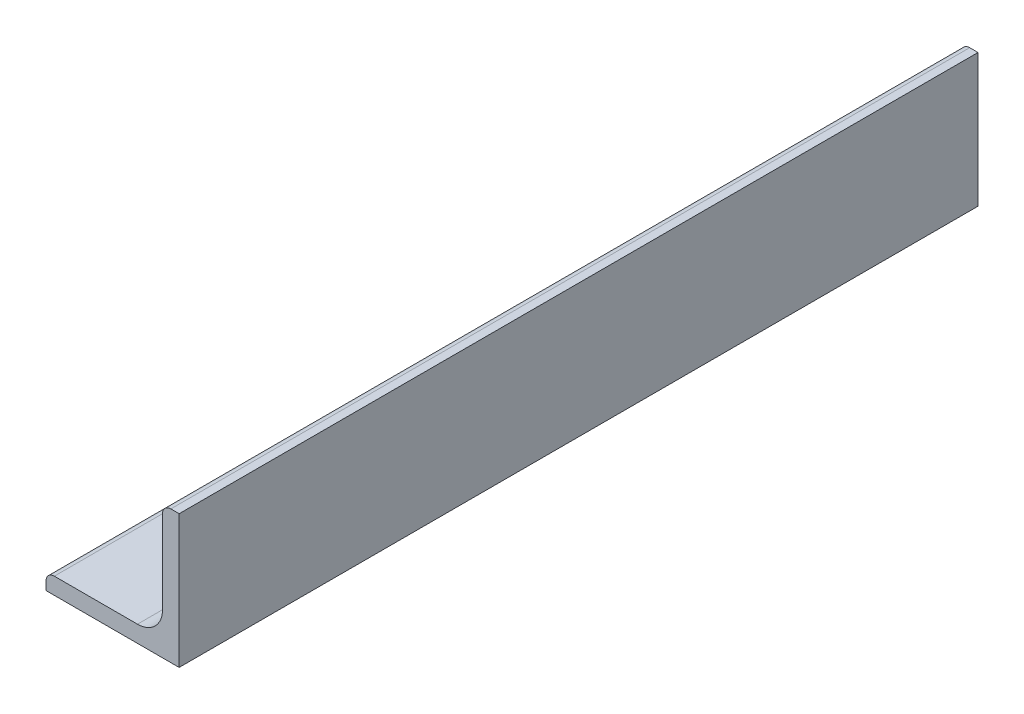
ISO-10303-21;
HEADER;
FILE_DESCRIPTION(('STEP AP214'),'2;1');
FILE_NAME('part.step','',(''),(''),'','','');
FILE_SCHEMA(('AUTOMOTIVE_DESIGN { 1 0 10303 214 1 1 1 1 }'));
ENDSEC;
DATA;
#1=APPLICATION_CONTEXT('core data for automotive mechanical design processes');
#2=APPLICATION_PROTOCOL_DEFINITION('international standard','automotive_design',2000,#1);
#3=PRODUCT_CONTEXT('',#1,'mechanical');
#4=PRODUCT('Part','Part','',(#3));
#5=PRODUCT_RELATED_PRODUCT_CATEGORY('part','',(#4));
#6=PRODUCT_DEFINITION_FORMATION('','',#4);
#7=PRODUCT_DEFINITION_CONTEXT('part definition',#1,'design');
#8=PRODUCT_DEFINITION('design','',#6,#7);
#9=PRODUCT_DEFINITION_SHAPE('','',#8);
#10=(LENGTH_UNIT() NAMED_UNIT(*) SI_UNIT(.MILLI.,.METRE.));
#11=(NAMED_UNIT(*) PLANE_ANGLE_UNIT() SI_UNIT($,.RADIAN.));
#12=(NAMED_UNIT(*) SI_UNIT($,.STERADIAN.) SOLID_ANGLE_UNIT());
#13=UNCERTAINTY_MEASURE_WITH_UNIT(LENGTH_MEASURE(1.E-05),#10,'distance_accuracy_value','');
#14=(GEOMETRIC_REPRESENTATION_CONTEXT(3) GLOBAL_UNCERTAINTY_ASSIGNED_CONTEXT((#13)) GLOBAL_UNIT_ASSIGNED_CONTEXT((#10,
#11,#12)) REPRESENTATION_CONTEXT('',''));
#15=CARTESIAN_POINT('',(0.,0.,0.));
#16=DIRECTION('',(0.,0.,1.));
#17=DIRECTION('',(1.,0.,0.));
#18=AXIS2_PLACEMENT_3D('',#15,#16,#17);
#19=CARTESIAN_POINT('',(-12.7,-11.1125,76.2));
#20=DIRECTION('',(1.,0.,0.));
#21=DIRECTION('',(0.,1.,0.));
#22=AXIS2_PLACEMENT_3D('',#19,#20,#21);
#23=PLANE('',#22);
#24=DIRECTION('',(0.,-1.,0.));
#25=VECTOR('',#24,1.);
#26=CARTESIAN_POINT('',(-12.7,-11.1125,-76.2));
#27=LINE('',#26,#25);
#28=CARTESIAN_POINT('',(-12.7,-11.1125,-76.2));
#29=VERTEX_POINT('',#28);
#30=CARTESIAN_POINT('',(-12.7,-12.7,-76.2));
#31=VERTEX_POINT('',#30);
#32=EDGE_CURVE('E152',#29,#31,#27,.T.);
#33=ORIENTED_EDGE('',*,*,#32,.T.);
#34=DIRECTION('',(0.,0.,-1.));
#35=VECTOR('',#34,1.);
#36=CARTESIAN_POINT('',(-12.7,-12.7,76.2));
#37=LINE('',#36,#35);
#38=CARTESIAN_POINT('',(-12.7,-12.7,76.2));
#39=VERTEX_POINT('',#38);
#40=EDGE_CURVE('E11',#39,#31,#37,.T.);
#41=ORIENTED_EDGE('',*,*,#40,.F.);
#42=DIRECTION('',(0.,-1.,0.));
#43=VECTOR('',#42,1.);
#44=CARTESIAN_POINT('',(-12.7,-11.1125,76.2));
#45=LINE('',#44,#43);
#46=CARTESIAN_POINT('',(-12.7,-11.1125,76.2));
#47=VERTEX_POINT('',#46);
#48=EDGE_CURVE('E177',#47,#39,#45,.T.);
#49=ORIENTED_EDGE('',*,*,#48,.F.);
#50=DIRECTION('',(0.,0.,-1.));
#51=VECTOR('',#50,1.);
#52=CARTESIAN_POINT('',(-12.7,-11.1125,76.2));
#53=LINE('',#52,#51);
#54=EDGE_CURVE('E148',#47,#29,#53,.T.);
#55=ORIENTED_EDGE('',*,*,#54,.T.);
#56=EDGE_LOOP('',(#33,#41,#49,#55));
#57=FACE_BOUND('',#56,.T.);
#58=ADVANCED_FACE('F45',(#57),#23,.F.);
#59=CARTESIAN_POINT('',(-12.7,-12.7,76.2));
#60=DIRECTION('',(0.,1.,0.));
#61=DIRECTION('',(-1.,0.,0.));
#62=AXIS2_PLACEMENT_3D('',#59,#60,#61);
#63=PLANE('',#62);
#64=DIRECTION('',(1.,0.,0.));
#65=VECTOR('',#64,1.);
#66=CARTESIAN_POINT('',(-12.7,-12.7,-76.2));
#67=LINE('',#66,#65);
#68=CARTESIAN_POINT('',(12.7,-12.7,-76.2));
#69=VERTEX_POINT('',#68);
#70=EDGE_CURVE('E156',#31,#69,#67,.T.);
#71=ORIENTED_EDGE('',*,*,#70,.T.);
#72=DIRECTION('',(0.,0.,-1.));
#73=VECTOR('',#72,1.);
#74=CARTESIAN_POINT('',(12.7,-12.7,76.2));
#75=LINE('',#74,#73);
#76=CARTESIAN_POINT('',(12.7,-12.7,76.2));
#77=VERTEX_POINT('',#76);
#78=EDGE_CURVE('E54',#77,#69,#75,.T.);
#79=ORIENTED_EDGE('',*,*,#78,.F.);
#80=DIRECTION('',(1.,0.,0.));
#81=VECTOR('',#80,1.);
#82=CARTESIAN_POINT('',(-12.7,-12.7,76.2));
#83=LINE('',#82,#81);
#84=EDGE_CURVE('E108',#39,#77,#83,.T.);
#85=ORIENTED_EDGE('',*,*,#84,.F.);
#86=ORIENTED_EDGE('',*,*,#40,.T.);
#87=EDGE_LOOP('',(#71,#79,#85,#86));
#88=FACE_BOUND('',#87,.T.);
#89=ADVANCED_FACE('F233',(#88),#63,.F.);
#90=CARTESIAN_POINT('',(12.7,-12.7,76.2));
#91=DIRECTION('',(-1.,0.,0.));
#92=DIRECTION('',(0.,-1.,0.));
#93=AXIS2_PLACEMENT_3D('',#90,#91,#92);
#94=PLANE('',#93);
#95=DIRECTION('',(0.,1.,0.));
#96=VECTOR('',#95,1.);
#97=CARTESIAN_POINT('',(12.7,-12.7,-76.2));
#98=LINE('',#97,#96);
#99=CARTESIAN_POINT('',(12.7,12.7,-76.2));
#100=VERTEX_POINT('',#99);
#101=EDGE_CURVE('E159',#69,#100,#98,.T.);
#102=ORIENTED_EDGE('',*,*,#101,.T.);
#103=DIRECTION('',(0.,0.,-1.));
#104=VECTOR('',#103,1.);
#105=CARTESIAN_POINT('',(12.7,12.7,76.2));
#106=LINE('',#105,#104);
#107=CARTESIAN_POINT('',(12.7,12.7,76.2));
#108=VERTEX_POINT('',#107);
#109=EDGE_CURVE('E192',#108,#100,#106,.T.);
#110=ORIENTED_EDGE('',*,*,#109,.F.);
#111=DIRECTION('',(0.,1.,0.));
#112=VECTOR('',#111,1.);
#113=CARTESIAN_POINT('',(12.7,-12.7,76.2));
#114=LINE('',#113,#112);
#115=EDGE_CURVE('E202',#77,#108,#114,.T.);
#116=ORIENTED_EDGE('',*,*,#115,.F.);
#117=ORIENTED_EDGE('',*,*,#78,.T.);
#118=EDGE_LOOP('',(#102,#110,#116,#117));
#119=FACE_BOUND('',#118,.T.);
#120=ADVANCED_FACE('F200',(#119),#94,.F.);
#121=CARTESIAN_POINT('',(11.1125,12.7,76.2));
#122=DIRECTION('',(0.,-1.,0.));
#123=DIRECTION('',(0.,0.,-1.));
#124=AXIS2_PLACEMENT_3D('',#121,#122,#123);
#125=PLANE('',#124);
#126=DIRECTION('',(-1.,0.,0.));
#127=VECTOR('',#126,1.);
#128=CARTESIAN_POINT('',(11.1125,12.7,-76.2));
#129=LINE('',#128,#127);
#130=CARTESIAN_POINT('',(11.1125,12.7,-76.2));
#131=VERTEX_POINT('',#130);
#132=EDGE_CURVE('E162',#100,#131,#129,.T.);
#133=ORIENTED_EDGE('',*,*,#132,.T.);
#134=DIRECTION('',(0.,0.,-1.));
#135=VECTOR('',#134,1.);
#136=CARTESIAN_POINT('',(11.1125,12.7,76.2));
#137=LINE('',#136,#135);
#138=CARTESIAN_POINT('',(11.1125,12.7,76.2));
#139=VERTEX_POINT('',#138);
#140=EDGE_CURVE('E188',#139,#131,#137,.T.);
#141=ORIENTED_EDGE('',*,*,#140,.F.);
#142=DIRECTION('',(-1.,0.,0.));
#143=VECTOR('',#142,1.);
#144=CARTESIAN_POINT('',(11.1125,12.7,76.2));
#145=LINE('',#144,#143);
#146=EDGE_CURVE('E219',#108,#139,#145,.T.);
#147=ORIENTED_EDGE('',*,*,#146,.F.);
#148=ORIENTED_EDGE('',*,*,#109,.T.);
#149=EDGE_LOOP('',(#133,#141,#147,#148));
#150=FACE_BOUND('',#149,.T.);
#151=ADVANCED_FACE('F211',(#150),#125,.F.);
#152=CARTESIAN_POINT('',(11.1125,11.1125,76.2));
#153=DIRECTION('',(0.,0.,-1.));
#154=DIRECTION('',(-1.,0.,0.));
#155=AXIS2_PLACEMENT_3D('',#152,#153,#154);
#156=CYLINDRICAL_SURFACE('',#155,1.5875);
#157=CARTESIAN_POINT('',(11.1125,11.1125,-76.2));
#158=DIRECTION('',(0.,0.,1.));
#159=DIRECTION('',(-1.,0.,0.));
#160=AXIS2_PLACEMENT_3D('',#157,#158,#159);
#161=CIRCLE('',#160,1.5875);
#162=CARTESIAN_POINT('',(9.525,11.1125,-76.2));
#163=VERTEX_POINT('',#162);
#164=EDGE_CURVE('E165',#131,#163,#161,.T.);
#165=ORIENTED_EDGE('',*,*,#164,.T.);
#166=DIRECTION('',(0.,0.,-1.));
#167=VECTOR('',#166,1.);
#168=CARTESIAN_POINT('',(9.525,11.1125,76.2));
#169=LINE('',#168,#167);
#170=CARTESIAN_POINT('',(9.525,11.1125,76.2));
#171=VERTEX_POINT('',#170);
#172=EDGE_CURVE('E184',#171,#163,#169,.T.);
#173=ORIENTED_EDGE('',*,*,#172,.F.);
#174=CARTESIAN_POINT('',(11.1125,11.1125,76.2));
#175=DIRECTION('',(0.,0.,1.));
#176=DIRECTION('',(-1.,0.,0.));
#177=AXIS2_PLACEMENT_3D('',#174,#175,#176);
#178=CIRCLE('',#177,1.5875);
#179=EDGE_CURVE('E217',#139,#171,#178,.T.);
#180=ORIENTED_EDGE('',*,*,#179,.F.);
#181=ORIENTED_EDGE('',*,*,#140,.T.);
#182=EDGE_LOOP('',(#165,#173,#180,#181));
#183=FACE_BOUND('',#182,.T.);
#184=ADVANCED_FACE('F215',(#183),#156,.T.);
#185=CARTESIAN_POINT('',(9.525,11.1125,76.2));
#186=DIRECTION('',(1.,0.,0.));
#187=DIRECTION('',(0.,0.,-1.));
#188=AXIS2_PLACEMENT_3D('',#185,#186,#187);
#189=PLANE('',#188);
#190=DIRECTION('',(0.,-1.,0.));
#191=VECTOR('',#190,1.);
#192=CARTESIAN_POINT('',(9.525,11.1125,-76.2));
#193=LINE('',#192,#191);
#194=CARTESIAN_POINT('',(9.525,-4.74979999999999,-76.2));
#195=VERTEX_POINT('',#194);
#196=EDGE_CURVE('E168',#163,#195,#193,.T.);
#197=ORIENTED_EDGE('',*,*,#196,.T.);
#198=DIRECTION('',(0.,0.,-1.));
#199=VECTOR('',#198,1.);
#200=CARTESIAN_POINT('',(9.525,-4.74979999999999,76.2));
#201=LINE('',#200,#199);
#202=CARTESIAN_POINT('',(9.525,-4.74979999999999,76.2));
#203=VERTEX_POINT('',#202);
#204=EDGE_CURVE('E141',#203,#195,#201,.T.);
#205=ORIENTED_EDGE('',*,*,#204,.F.);
#206=DIRECTION('',(0.,-1.,0.));
#207=VECTOR('',#206,1.);
#208=CARTESIAN_POINT('',(9.525,11.1125,76.2));
#209=LINE('',#208,#207);
#210=EDGE_CURVE('E130',#171,#203,#209,.T.);
#211=ORIENTED_EDGE('',*,*,#210,.F.);
#212=ORIENTED_EDGE('',*,*,#172,.T.);
#213=EDGE_LOOP('',(#197,#205,#211,#212));
#214=FACE_BOUND('',#213,.T.);
#215=ADVANCED_FACE('F245',(#214),#189,.F.);
#216=CARTESIAN_POINT('',(4.7498,-4.74979999999999,76.2));
#217=DIRECTION('',(0.,0.,-1.));
#218=DIRECTION('',(-1.,0.,0.));
#219=AXIS2_PLACEMENT_3D('',#216,#217,#218);
#220=CYLINDRICAL_SURFACE('',#219,4.7752);
#221=CARTESIAN_POINT('',(4.7498,-4.74979999999999,-76.2));
#222=DIRECTION('',(0.,0.,-1.));
#223=DIRECTION('',(-1.,0.,0.));
#224=AXIS2_PLACEMENT_3D('',#221,#222,#223);
#225=CIRCLE('',#224,4.7752);
#226=CARTESIAN_POINT('',(4.7498,-9.525,-76.2));
#227=VERTEX_POINT('',#226);
#228=EDGE_CURVE('E139',#195,#227,#225,.T.);
#229=ORIENTED_EDGE('',*,*,#228,.T.);
#230=DIRECTION('',(0.,0.,-1.));
#231=VECTOR('',#230,1.);
#232=CARTESIAN_POINT('',(4.7498,-9.525,76.2));
#233=LINE('',#232,#231);
#234=CARTESIAN_POINT('',(4.7498,-9.525,76.2));
#235=VERTEX_POINT('',#234);
#236=EDGE_CURVE('E136',#235,#227,#233,.T.);
#237=ORIENTED_EDGE('',*,*,#236,.F.);
#238=CARTESIAN_POINT('',(4.7498,-4.74979999999999,76.2));
#239=DIRECTION('',(0.,0.,-1.));
#240=DIRECTION('',(-1.,0.,0.));
#241=AXIS2_PLACEMENT_3D('',#238,#239,#240);
#242=CIRCLE('',#241,4.7752);
#243=EDGE_CURVE('E124',#203,#235,#242,.T.);
#244=ORIENTED_EDGE('',*,*,#243,.F.);
#245=ORIENTED_EDGE('',*,*,#204,.T.);
#246=EDGE_LOOP('',(#229,#237,#244,#245));
#247=FACE_BOUND('',#246,.T.);
#248=ADVANCED_FACE('F137',(#247),#220,.F.);
#249=CARTESIAN_POINT('',(4.7498,-9.525,76.2));
#250=DIRECTION('',(0.,-1.,0.));
#251=DIRECTION('',(1.,0.,0.));
#252=AXIS2_PLACEMENT_3D('',#249,#250,#251);
#253=PLANE('',#252);
#254=DIRECTION('',(-1.,0.,0.));
#255=VECTOR('',#254,1.);
#256=CARTESIAN_POINT('',(4.7498,-9.525,-76.2));
#257=LINE('',#256,#255);
#258=CARTESIAN_POINT('',(-11.1125,-9.525,-76.2));
#259=VERTEX_POINT('',#258);
#260=EDGE_CURVE('E94',#227,#259,#257,.T.);
#261=ORIENTED_EDGE('',*,*,#260,.T.);
#262=DIRECTION('',(0.,0.,-1.));
#263=VECTOR('',#262,1.);
#264=CARTESIAN_POINT('',(-11.1125,-9.525,76.2));
#265=LINE('',#264,#263);
#266=CARTESIAN_POINT('',(-11.1125,-9.525,76.2));
#267=VERTEX_POINT('',#266);
#268=EDGE_CURVE('E142',#267,#259,#265,.T.);
#269=ORIENTED_EDGE('',*,*,#268,.F.);
#270=DIRECTION('',(-1.,0.,0.));
#271=VECTOR('',#270,1.);
#272=CARTESIAN_POINT('',(4.7498,-9.525,76.2));
#273=LINE('',#272,#271);
#274=EDGE_CURVE('E128',#235,#267,#273,.T.);
#275=ORIENTED_EDGE('',*,*,#274,.F.);
#276=ORIENTED_EDGE('',*,*,#236,.T.);
#277=EDGE_LOOP('',(#261,#269,#275,#276));
#278=FACE_BOUND('',#277,.T.);
#279=ADVANCED_FACE('F144',(#278),#253,.F.);
#280=CARTESIAN_POINT('',(-11.1125,-11.1125,76.2));
#281=DIRECTION('',(0.,0.,-1.));
#282=DIRECTION('',(-1.,0.,0.));
#283=AXIS2_PLACEMENT_3D('',#280,#281,#282);
#284=CYLINDRICAL_SURFACE('',#283,1.5875);
#285=CARTESIAN_POINT('',(-11.1125,-11.1125,-76.2));
#286=DIRECTION('',(0.,0.,1.));
#287=DIRECTION('',(-1.,0.,0.));
#288=AXIS2_PLACEMENT_3D('',#285,#286,#287);
#289=CIRCLE('',#288,1.5875);
#290=EDGE_CURVE('E100',#259,#29,#289,.T.);
#291=ORIENTED_EDGE('',*,*,#290,.T.);
#292=ORIENTED_EDGE('',*,*,#54,.F.);
#293=CARTESIAN_POINT('',(-11.1125,-11.1125,76.2));
#294=DIRECTION('',(0.,0.,1.));
#295=DIRECTION('',(-1.,0.,0.));
#296=AXIS2_PLACEMENT_3D('',#293,#294,#295);
#297=CIRCLE('',#296,1.5875);
#298=EDGE_CURVE('E62',#267,#47,#297,.T.);
#299=ORIENTED_EDGE('',*,*,#298,.F.);
#300=ORIENTED_EDGE('',*,*,#268,.T.);
#301=EDGE_LOOP('',(#291,#292,#299,#300));
#302=FACE_BOUND('',#301,.T.);
#303=ADVANCED_FACE('F253',(#302),#284,.T.);
#304=CARTESIAN_POINT('',(11.1125,11.1125,76.2));
#305=DIRECTION('',(0.,0.,-1.));
#306=DIRECTION('',(-1.,0.,0.));
#307=AXIS2_PLACEMENT_3D('',#304,#305,#306);
#308=PLANE('',#307);
#309=ORIENTED_EDGE('',*,*,#48,.T.);
#310=ORIENTED_EDGE('',*,*,#84,.T.);
#311=ORIENTED_EDGE('',*,*,#115,.T.);
#312=ORIENTED_EDGE('',*,*,#146,.T.);
#313=ORIENTED_EDGE('',*,*,#179,.T.);
#314=ORIENTED_EDGE('',*,*,#210,.T.);
#315=ORIENTED_EDGE('',*,*,#243,.T.);
#316=ORIENTED_EDGE('',*,*,#274,.T.);
#317=ORIENTED_EDGE('',*,*,#298,.T.);
#318=EDGE_LOOP('',(#309,#310,#311,#312,#313,#314,#315,#316,#317));
#319=FACE_BOUND('',#318,.T.);
#320=ADVANCED_FACE('F126',(#319),#308,.F.);
#321=CARTESIAN_POINT('',(11.1125,11.1125,-76.2));
#322=DIRECTION('',(0.,0.,-1.));
#323=DIRECTION('',(-1.,0.,0.));
#324=AXIS2_PLACEMENT_3D('',#321,#322,#323);
#325=PLANE('',#324);
#326=ORIENTED_EDGE('',*,*,#32,.F.);
#327=ORIENTED_EDGE('',*,*,#290,.F.);
#328=ORIENTED_EDGE('',*,*,#260,.F.);
#329=ORIENTED_EDGE('',*,*,#228,.F.);
#330=ORIENTED_EDGE('',*,*,#196,.F.);
#331=ORIENTED_EDGE('',*,*,#164,.F.);
#332=ORIENTED_EDGE('',*,*,#132,.F.);
#333=ORIENTED_EDGE('',*,*,#101,.F.);
#334=ORIENTED_EDGE('',*,*,#70,.F.);
#335=EDGE_LOOP('',(#326,#327,#328,#329,#330,#331,#332,#333,#334));
#336=FACE_BOUND('',#335,.T.);
#337=ADVANCED_FACE('F206',(#336),#325,.T.);
#338=CLOSED_SHELL('',(#58,#89,#120,#151,#184,#215,#248,#279,#303,#320,#337));
#339=MANIFOLD_SOLID_BREP('B2',#338);
#340=ADVANCED_BREP_SHAPE_REPRESENTATION('',(#18,#339),#14);
#341=SHAPE_DEFINITION_REPRESENTATION(#9,#340);
ENDSEC;
END-ISO-10303-21;
